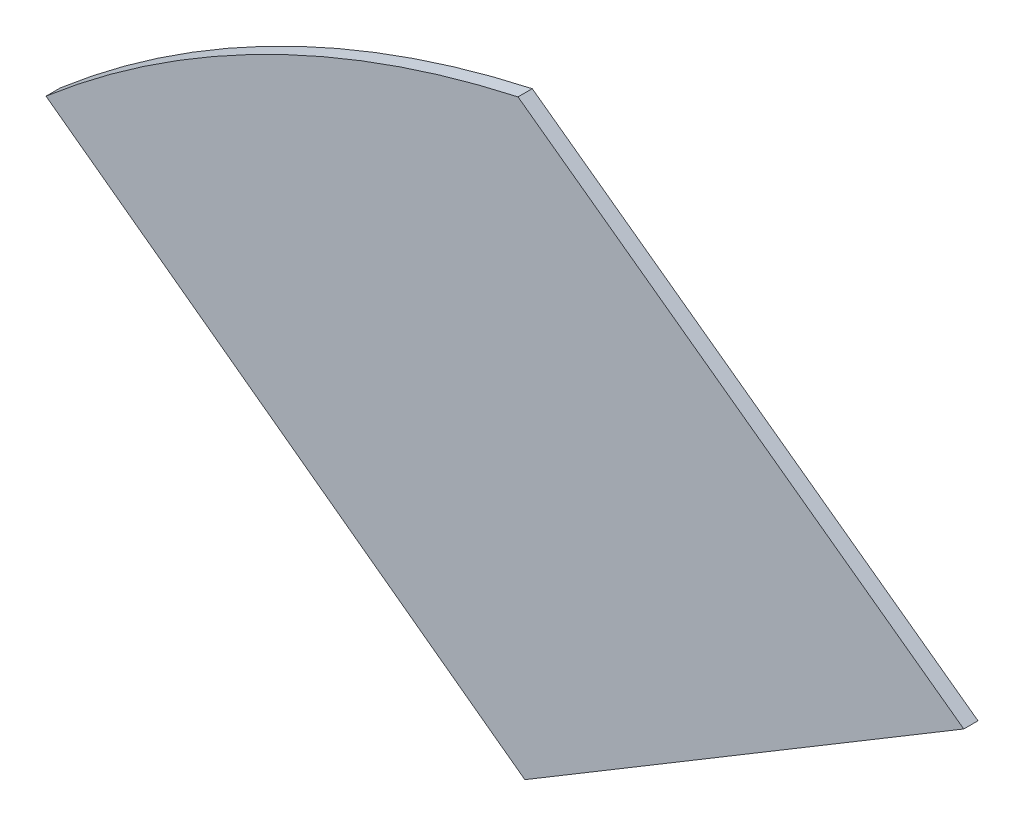
ISO-10303-21;
HEADER;
FILE_DESCRIPTION(('STEP AP214'),'2;1');
FILE_NAME('part.step','',(''),(''),'','','');
FILE_SCHEMA(('AUTOMOTIVE_DESIGN { 1 0 10303 214 1 1 1 1 }'));
ENDSEC;
DATA;
#1=APPLICATION_CONTEXT('core data for automotive mechanical design processes');
#2=APPLICATION_PROTOCOL_DEFINITION('international standard','automotive_design',2000,#1);
#3=PRODUCT_CONTEXT('',#1,'mechanical');
#4=PRODUCT('Part','Part','',(#3));
#5=PRODUCT_RELATED_PRODUCT_CATEGORY('part','',(#4));
#6=PRODUCT_DEFINITION_FORMATION('','',#4);
#7=PRODUCT_DEFINITION_CONTEXT('part definition',#1,'design');
#8=PRODUCT_DEFINITION('design','',#6,#7);
#9=PRODUCT_DEFINITION_SHAPE('','',#8);
#10=(LENGTH_UNIT() NAMED_UNIT(*) SI_UNIT(.MILLI.,.METRE.));
#11=(NAMED_UNIT(*) PLANE_ANGLE_UNIT() SI_UNIT($,.RADIAN.));
#12=(NAMED_UNIT(*) SI_UNIT($,.STERADIAN.) SOLID_ANGLE_UNIT());
#13=UNCERTAINTY_MEASURE_WITH_UNIT(LENGTH_MEASURE(1.E-05),#10,'distance_accuracy_value','');
#14=(GEOMETRIC_REPRESENTATION_CONTEXT(3) GLOBAL_UNCERTAINTY_ASSIGNED_CONTEXT((#13)) GLOBAL_UNIT_ASSIGNED_CONTEXT((#10,
#11,#12)) REPRESENTATION_CONTEXT('',''));
#15=CARTESIAN_POINT('',(0.,0.,0.));
#16=DIRECTION('',(0.,0.,1.));
#17=DIRECTION('',(1.,0.,0.));
#18=AXIS2_PLACEMENT_3D('',#15,#16,#17);
#19=CARTESIAN_POINT('',(32.574920494297,13.734089114766,2.64));
#20=DIRECTION('',(0.,0.,1.));
#21=DIRECTION('',(1.,0.,0.));
#22=AXIS2_PLACEMENT_3D('',#19,#20,#21);
#23=PLANE('',#22);
#24=DIRECTION('',(-0.857492968552453,-0.514495684027672,0.));
#25=VECTOR('',#24,1.);
#26=CARTESIAN_POINT('',(31.452125710856,17.400019007797,2.64));
#27=LINE('',#26,#25);
#28=CARTESIAN_POINT('',(31.6063294752514,17.4925412489725,2.64));
#29=VERTEX_POINT('',#28);
#30=CARTESIAN_POINT('',(31.2979219464602,17.3074967666218,2.64));
#31=VERTEX_POINT('',#30);
#32=EDGE_CURVE('E63',#29,#31,#27,.T.);
#33=ORIENTED_EDGE('',*,*,#32,.T.);
#34=DIRECTION('',(-0.805324891887206,0.592833719104152,0.));
#35=VECTOR('',#34,1.);
#36=CARTESIAN_POINT('',(31.129676602503,17.431349281284,2.64));
#37=LINE('',#36,#35);
#38=CARTESIAN_POINT('',(30.9614312759839,17.555201783109,2.64));
#39=VERTEX_POINT('',#38);
#40=EDGE_CURVE('E59',#31,#39,#37,.T.);
#41=ORIENTED_EDGE('',*,*,#40,.T.);
#42=CARTESIAN_POINT('',(31.455723480902,16.979222091636,2.64));
#43=DIRECTION('',(0.,0.,-1.));
#44=DIRECTION('',(-1.,0.,0.));
#45=AXIS2_PLACEMENT_3D('',#42,#43,#44);
#46=CIRCLE('',#45,0.7589976);
#47=CARTESIAN_POINT('',(31.293100080561,17.7205931097283,2.64));
#48=VERTEX_POINT('',#47);
#49=EDGE_CURVE('E20',#48,#39,#46,.F.);
#50=ORIENTED_EDGE('',*,*,#49,.F.);
#51=DIRECTION('',(0.808430669272748,-0.588591414292816,0.));
#52=VECTOR('',#51,1.);
#53=CARTESIAN_POINT('',(31.449714764247,17.606567197954,2.64));
#54=LINE('',#53,#52);
#55=EDGE_CURVE('E55',#48,#29,#54,.T.);
#56=ORIENTED_EDGE('',*,*,#55,.T.);
#57=EDGE_LOOP('',(#33,#41,#50,#56));
#58=FACE_BOUND('',#57,.T.);
#59=ADVANCED_FACE('F17',(#58),#23,.F.);
#60=CARTESIAN_POINT('',(31.449714764247,17.606567197954,2.64));
#61=DIRECTION('',(-0.588591414292816,-0.808430669272748,0.));
#62=DIRECTION('',(0.808430669272748,-0.588591414292816,0.));
#63=AXIS2_PLACEMENT_3D('',#60,#61,#62);
#64=PLANE('',#63);
#65=DIRECTION('',(0.,0.,1.));
#66=VECTOR('',#65,1.);
#67=CARTESIAN_POINT('',(31.6063294752516,17.4925412489721,2.64));
#68=LINE('',#67,#66);
#69=CARTESIAN_POINT('',(31.6063294752512,17.4925412489727,2.65));
#70=VERTEX_POINT('',#69);
#71=EDGE_CURVE('E74',#70,#29,#68,.F.);
#72=ORIENTED_EDGE('',*,*,#71,.T.);
#73=ORIENTED_EDGE('',*,*,#55,.F.);
#74=DIRECTION('',(0.,0.,-1.));
#75=VECTOR('',#74,1.);
#76=CARTESIAN_POINT('',(31.2931000622829,17.720593105719,2.64));
#77=LINE('',#76,#75);
#78=CARTESIAN_POINT('',(31.2931000805608,17.7205931097283,2.65));
#79=VERTEX_POINT('',#78);
#80=EDGE_CURVE('E70',#79,#48,#77,.T.);
#81=ORIENTED_EDGE('',*,*,#80,.F.);
#82=DIRECTION('',(-0.808430669272843,0.588591414292685,0.));
#83=VECTOR('',#82,1.);
#84=CARTESIAN_POINT('',(31.606329475251,17.492541248973,2.65));
#85=LINE('',#84,#83);
#86=EDGE_CURVE('E84',#70,#79,#85,.T.);
#87=ORIENTED_EDGE('',*,*,#86,.F.);
#88=EDGE_LOOP('',(#72,#73,#81,#87));
#89=FACE_BOUND('',#88,.T.);
#90=ADVANCED_FACE('F105',(#89),#64,.F.);
#91=CARTESIAN_POINT('',(31.455723480902,16.979222091636,2.64));
#92=DIRECTION('',(0.,0.,-1.));
#93=DIRECTION('',(-1.,0.,0.));
#94=AXIS2_PLACEMENT_3D('',#91,#92,#93);
#95=CYLINDRICAL_SURFACE('',#94,0.7589976);
#96=ORIENTED_EDGE('',*,*,#49,.T.);
#97=DIRECTION('',(0.,0.,1.));
#98=VECTOR('',#97,1.);
#99=CARTESIAN_POINT('',(30.9614312585459,17.5552017959459,2.64));
#100=LINE('',#99,#98);
#101=CARTESIAN_POINT('',(30.961431275984,17.5552017831091,2.65));
#102=VERTEX_POINT('',#101);
#103=EDGE_CURVE('E65',#39,#102,#100,.T.);
#104=ORIENTED_EDGE('',*,*,#103,.T.);
#105=CARTESIAN_POINT('',(31.455723480902,16.979222091636,2.65));
#106=DIRECTION('',(0.,0.,-1.));
#107=DIRECTION('',(-1.,0.,0.));
#108=AXIS2_PLACEMENT_3D('',#105,#106,#107);
#109=CIRCLE('',#108,0.7589976);
#110=EDGE_CURVE('E97',#79,#102,#109,.F.);
#111=ORIENTED_EDGE('',*,*,#110,.F.);
#112=ORIENTED_EDGE('',*,*,#80,.T.);
#113=EDGE_LOOP('',(#96,#104,#111,#112));
#114=FACE_BOUND('',#113,.T.);
#115=ADVANCED_FACE('F68',(#114),#95,.T.);
#116=CARTESIAN_POINT('',(31.129676602503,17.431349281284,2.64));
#117=DIRECTION('',(0.592833719104152,0.805324891887206,0.));
#118=DIRECTION('',(-0.805324891887206,0.592833719104152,0.));
#119=AXIS2_PLACEMENT_3D('',#116,#117,#118);
#120=PLANE('',#119);
#121=ORIENTED_EDGE('',*,*,#103,.F.);
#122=ORIENTED_EDGE('',*,*,#40,.F.);
#123=DIRECTION('',(0.,0.,1.));
#124=VECTOR('',#123,1.);
#125=CARTESIAN_POINT('',(31.2979219464601,17.3074967666218,2.64));
#126=LINE('',#125,#124);
#127=CARTESIAN_POINT('',(31.29792194646,17.3074967666219,2.65));
#128=VERTEX_POINT('',#127);
#129=EDGE_CURVE('E35',#31,#128,#126,.T.);
#130=ORIENTED_EDGE('',*,*,#129,.T.);
#131=DIRECTION('',(0.805324891886777,-0.592833719104734,0.));
#132=VECTOR('',#131,1.);
#133=CARTESIAN_POINT('',(30.961431258546,17.555201795946,2.65));
#134=LINE('',#133,#132);
#135=EDGE_CURVE('E26',#102,#128,#134,.T.);
#136=ORIENTED_EDGE('',*,*,#135,.F.);
#137=EDGE_LOOP('',(#121,#122,#130,#136));
#138=FACE_BOUND('',#137,.T.);
#139=ADVANCED_FACE('F71',(#138),#120,.F.);
#140=CARTESIAN_POINT('',(31.452125710856,17.400019007797,2.64));
#141=DIRECTION('',(-0.514495684027672,0.857492968552453,0.));
#142=DIRECTION('',(-0.857492968552453,-0.514495684027672,0.));
#143=AXIS2_PLACEMENT_3D('',#140,#141,#142);
#144=PLANE('',#143);
#145=ORIENTED_EDGE('',*,*,#129,.F.);
#146=ORIENTED_EDGE('',*,*,#32,.F.);
#147=ORIENTED_EDGE('',*,*,#71,.F.);
#148=DIRECTION('',(0.857492968551301,0.514495684029593,0.));
#149=VECTOR('',#148,1.);
#150=CARTESIAN_POINT('',(31.29792194646,17.307496766622,2.65));
#151=LINE('',#150,#149);
#152=EDGE_CURVE('E11',#128,#70,#151,.T.);
#153=ORIENTED_EDGE('',*,*,#152,.F.);
#154=EDGE_LOOP('',(#145,#146,#147,#153));
#155=FACE_BOUND('',#154,.T.);
#156=ADVANCED_FACE('F107',(#155),#144,.F.);
#157=CARTESIAN_POINT('',(32.574920494297,13.734089114766,2.65));
#158=DIRECTION('',(0.,0.,1.));
#159=DIRECTION('',(1.,0.,0.));
#160=AXIS2_PLACEMENT_3D('',#157,#158,#159);
#161=PLANE('',#160);
#162=ORIENTED_EDGE('',*,*,#135,.T.);
#163=ORIENTED_EDGE('',*,*,#152,.T.);
#164=ORIENTED_EDGE('',*,*,#86,.T.);
#165=ORIENTED_EDGE('',*,*,#110,.T.);
#166=EDGE_LOOP('',(#162,#163,#164,#165));
#167=FACE_BOUND('',#166,.T.);
#168=ADVANCED_FACE('F103',(#167),#161,.T.);
#169=CLOSED_SHELL('',(#59,#90,#115,#139,#156,#168));
#170=MANIFOLD_SOLID_BREP('B1',#169);
#171=ADVANCED_BREP_SHAPE_REPRESENTATION('',(#18,#170),#14);
#172=SHAPE_DEFINITION_REPRESENTATION(#9,#171);
ENDSEC;
END-ISO-10303-21;
